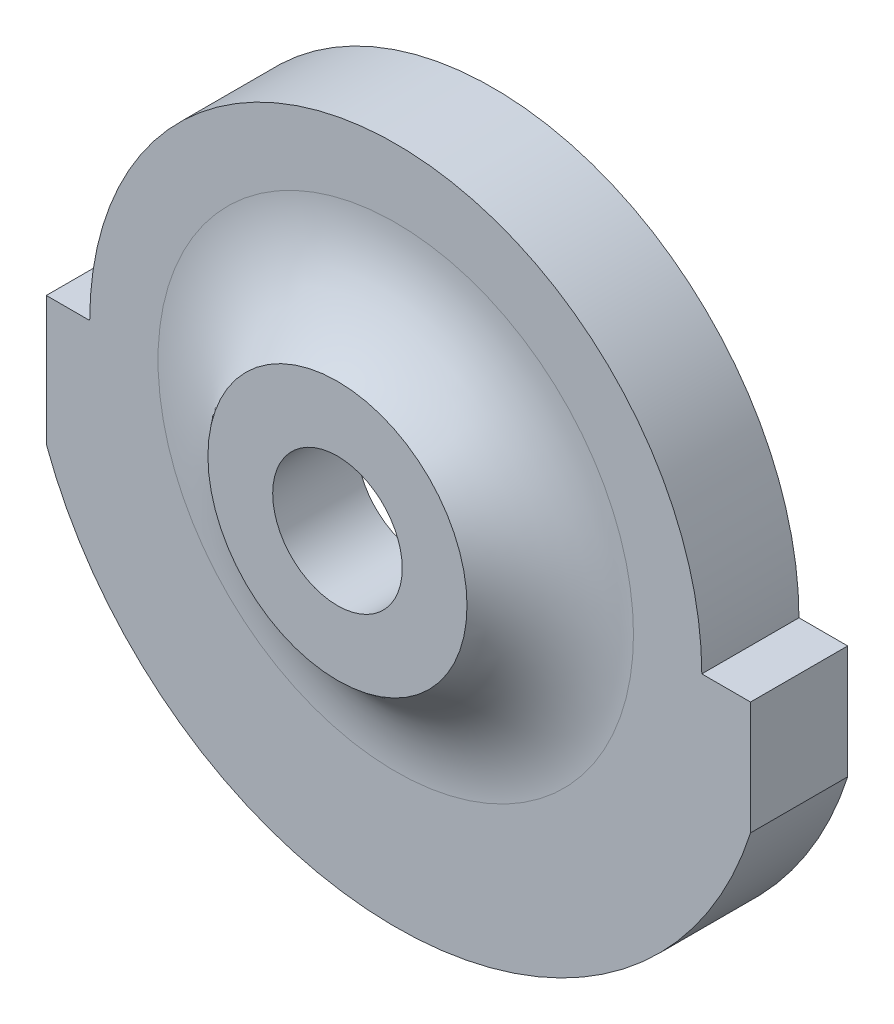
ISO-10303-21;
HEADER;
FILE_DESCRIPTION(('STEP AP214'),'2;1');
FILE_NAME('part.step','',(''),(''),'','','');
FILE_SCHEMA(('AUTOMOTIVE_DESIGN { 1 0 10303 214 1 1 1 1 }'));
ENDSEC;
DATA;
#1=APPLICATION_CONTEXT('core data for automotive mechanical design processes');
#2=APPLICATION_PROTOCOL_DEFINITION('international standard','automotive_design',2000,#1);
#3=PRODUCT_CONTEXT('',#1,'mechanical');
#4=PRODUCT('Part','Part','',(#3));
#5=PRODUCT_RELATED_PRODUCT_CATEGORY('part','',(#4));
#6=PRODUCT_DEFINITION_FORMATION('','',#4);
#7=PRODUCT_DEFINITION_CONTEXT('part definition',#1,'design');
#8=PRODUCT_DEFINITION('design','',#6,#7);
#9=PRODUCT_DEFINITION_SHAPE('','',#8);
#10=(LENGTH_UNIT() NAMED_UNIT(*) SI_UNIT(.MILLI.,.METRE.));
#11=(NAMED_UNIT(*) PLANE_ANGLE_UNIT() SI_UNIT($,.RADIAN.));
#12=(NAMED_UNIT(*) SI_UNIT($,.STERADIAN.) SOLID_ANGLE_UNIT());
#13=UNCERTAINTY_MEASURE_WITH_UNIT(LENGTH_MEASURE(1.E-05),#10,'distance_accuracy_value','');
#14=(GEOMETRIC_REPRESENTATION_CONTEXT(3) GLOBAL_UNCERTAINTY_ASSIGNED_CONTEXT((#13)) GLOBAL_UNIT_ASSIGNED_CONTEXT((#10,
#11,#12)) REPRESENTATION_CONTEXT('',''));
#15=CARTESIAN_POINT('',(0.,0.,0.));
#16=DIRECTION('',(0.,0.,1.));
#17=DIRECTION('',(1.,0.,0.));
#18=AXIS2_PLACEMENT_3D('',#15,#16,#17);
#19=CARTESIAN_POINT('',(-9.43689570931383E-13,7.91033905045424E-13,11.));
#20=DIRECTION('',(0.,0.,1.));
#21=DIRECTION('',(1.,0.,0.));
#22=AXIS2_PLACEMENT_3D('',#19,#20,#21);
#23=PLANE('',#22);
#24=DIRECTION('',(0.,1.,0.));
#25=VECTOR('',#24,1.);
#26=CARTESIAN_POINT('',(-10.7898330417497,0.,11.));
#27=LINE('',#26,#25);
#28=CARTESIAN_POINT('',(-10.7898330417497,-3.97863078598234,11.));
#29=VERTEX_POINT('',#28);
#30=CARTESIAN_POINT('',(-10.7898330417497,0.,11.));
#31=VERTEX_POINT('',#30);
#32=EDGE_CURVE('E56',#29,#31,#27,.T.);
#33=ORIENTED_EDGE('',*,*,#32,.F.);
#34=CARTESIAN_POINT('',(-9.43689570931383E-13,7.91033905045424E-13,11.));
#35=DIRECTION('',(0.,0.,1.));
#36=DIRECTION('',(1.,0.,0.));
#37=AXIS2_PLACEMENT_3D('',#34,#35,#36);
#38=CIRCLE('',#37,11.4999999999998);
#39=CARTESIAN_POINT('',(10.9544511501005,-3.50000000000316,11.));
#40=VERTEX_POINT('',#39);
#41=EDGE_CURVE('E169',#29,#40,#38,.T.);
#42=ORIENTED_EDGE('',*,*,#41,.T.);
#43=DIRECTION('',(0.,-1.,0.));
#44=VECTOR('',#43,1.);
#45=CARTESIAN_POINT('',(10.9544511501005,0.,11.));
#46=LINE('',#45,#44);
#47=CARTESIAN_POINT('',(10.9544511501005,0.,11.));
#48=VERTEX_POINT('',#47);
#49=EDGE_CURVE('E327',#48,#40,#46,.T.);
#50=ORIENTED_EDGE('',*,*,#49,.F.);
#51=DIRECTION('',(-1.,0.,0.));
#52=VECTOR('',#51,1.);
#53=CARTESIAN_POINT('',(-9.43689570931384E-13,0.,11.));
#54=LINE('',#53,#52);
#55=CARTESIAN_POINT('',(9.45,0.,11.));
#56=VERTEX_POINT('',#55);
#57=EDGE_CURVE('E218',#48,#56,#54,.T.);
#58=ORIENTED_EDGE('',*,*,#57,.T.);
#59=CARTESIAN_POINT('',(0.,0.,11.));
#60=DIRECTION('',(0.,0.,1.));
#61=DIRECTION('',(1.,0.,0.));
#62=AXIS2_PLACEMENT_3D('',#59,#60,#61);
#63=CIRCLE('',#62,9.45);
#64=CARTESIAN_POINT('',(-9.45,0.,11.));
#65=VERTEX_POINT('',#64);
#66=EDGE_CURVE('E220',#56,#65,#63,.T.);
#67=ORIENTED_EDGE('',*,*,#66,.T.);
#68=DIRECTION('',(-1.,0.,0.));
#69=VECTOR('',#68,1.);
#70=CARTESIAN_POINT('',(-9.43689570931382E-13,0.,11.));
#71=LINE('',#70,#69);
#72=EDGE_CURVE('E171',#65,#31,#71,.T.);
#73=ORIENTED_EDGE('',*,*,#72,.T.);
#74=EDGE_LOOP('',(#33,#42,#50,#58,#67,#73));
#75=FACE_BOUND('',#74,.T.);
#76=CARTESIAN_POINT('',(-9.43689570931383E-13,7.91033905045424E-13,11.));
#77=DIRECTION('',(0.,0.,1.));
#78=DIRECTION('',(1.,0.,0.));
#79=AXIS2_PLACEMENT_3D('',#76,#77,#78);
#80=CIRCLE('',#79,7.34065861769801);
#81=CARTESIAN_POINT('',(7.34065861769707,7.91033905045424E-13,11.));
#82=VERTEX_POINT('',#81);
#83=EDGE_CURVE('E177',#82,#82,#80,.F.);
#84=ORIENTED_EDGE('',*,*,#83,.T.);
#85=EDGE_LOOP('',(#84));
#86=FACE_BOUND('',#85,.T.);
#87=ADVANCED_FACE('F34',(#75,#86),#23,.T.);
#88=CARTESIAN_POINT('',(-9.43689570931383E-13,7.91033905045424E-13,8.));
#89=DIRECTION('',(0.,0.,1.));
#90=DIRECTION('',(1.,0.,0.));
#91=AXIS2_PLACEMENT_3D('',#88,#89,#90);
#92=PLANE('',#91);
#93=CARTESIAN_POINT('',(-9.43689570931383E-13,7.91033905045424E-13,8.));
#94=DIRECTION('',(0.,0.,1.));
#95=DIRECTION('',(1.,0.,0.));
#96=AXIS2_PLACEMENT_3D('',#93,#94,#95);
#97=CIRCLE('',#96,11.4999999999998);
#98=CARTESIAN_POINT('',(-10.7898330417497,-3.97863078598234,8.));
#99=VERTEX_POINT('',#98);
#100=CARTESIAN_POINT('',(4.57684389071445,-10.55,8.));
#101=VERTEX_POINT('',#100);
#102=EDGE_CURVE('E178',#99,#101,#97,.T.);
#103=ORIENTED_EDGE('',*,*,#102,.F.);
#104=DIRECTION('',(0.,1.,0.));
#105=VECTOR('',#104,1.);
#106=CARTESIAN_POINT('',(-10.7898330417497,7.91033905045424E-13,8.));
#107=LINE('',#106,#105);
#108=CARTESIAN_POINT('',(-10.7898330417497,0.,8.));
#109=VERTEX_POINT('',#108);
#110=EDGE_CURVE('E159',#99,#109,#107,.T.);
#111=ORIENTED_EDGE('',*,*,#110,.T.);
#112=DIRECTION('',(1.,0.,0.));
#113=VECTOR('',#112,1.);
#114=CARTESIAN_POINT('',(-11.4999999999994,0.,8.));
#115=LINE('',#114,#113);
#116=CARTESIAN_POINT('',(-9.45,0.,8.));
#117=VERTEX_POINT('',#116);
#118=EDGE_CURVE('E198',#109,#117,#115,.T.);
#119=ORIENTED_EDGE('',*,*,#118,.T.);
#120=CARTESIAN_POINT('',(0.,0.,8.));
#121=DIRECTION('',(0.,0.,-1.));
#122=DIRECTION('',(-1.,0.,0.));
#123=AXIS2_PLACEMENT_3D('',#120,#121,#122);
#124=CIRCLE('',#123,9.45);
#125=CARTESIAN_POINT('',(9.45,0.,8.));
#126=VERTEX_POINT('',#125);
#127=EDGE_CURVE('E206',#117,#126,#124,.T.);
#128=ORIENTED_EDGE('',*,*,#127,.T.);
#129=DIRECTION('',(1.,0.,0.));
#130=VECTOR('',#129,1.);
#131=CARTESIAN_POINT('',(11.4999999999994,0.,8.));
#132=LINE('',#131,#130);
#133=CARTESIAN_POINT('',(10.9544511501005,0.,8.));
#134=VERTEX_POINT('',#133);
#135=EDGE_CURVE('E208',#126,#134,#132,.T.);
#136=ORIENTED_EDGE('',*,*,#135,.T.);
#137=DIRECTION('',(0.,-1.,0.));
#138=VECTOR('',#137,1.);
#139=CARTESIAN_POINT('',(10.9544511501005,7.80175080144564E-13,8.));
#140=LINE('',#139,#138);
#141=CARTESIAN_POINT('',(10.9544511501005,-3.50000000000316,8.));
#142=VERTEX_POINT('',#141);
#143=EDGE_CURVE('E48',#134,#142,#140,.T.);
#144=ORIENTED_EDGE('',*,*,#143,.T.);
#145=CARTESIAN_POINT('',(7.69074118664563,-8.55,8.));
#146=VERTEX_POINT('',#145);
#147=EDGE_CURVE('E183',#146,#142,#97,.T.);
#148=ORIENTED_EDGE('',*,*,#147,.F.);
#149=DIRECTION('',(1.,0.,0.));
#150=VECTOR('',#149,1.);
#151=CARTESIAN_POINT('',(3.15,-8.55,8.));
#152=LINE('',#151,#150);
#153=CARTESIAN_POINT('',(3.15,-8.55,8.));
#154=VERTEX_POINT('',#153);
#155=EDGE_CURVE('E270',#154,#146,#152,.T.);
#156=ORIENTED_EDGE('',*,*,#155,.F.);
#157=DIRECTION('',(0.,-1.,0.));
#158=VECTOR('',#157,1.);
#159=CARTESIAN_POINT('',(3.15,-8.55,8.));
#160=LINE('',#159,#158);
#161=CARTESIAN_POINT('',(3.15,-6.55,8.));
#162=VERTEX_POINT('',#161);
#163=EDGE_CURVE('E267',#162,#154,#160,.T.);
#164=ORIENTED_EDGE('',*,*,#163,.F.);
#165=DIRECTION('',(-1.,0.,0.));
#166=VECTOR('',#165,1.);
#167=CARTESIAN_POINT('',(5.55,-6.55,8.));
#168=LINE('',#167,#166);
#169=CARTESIAN_POINT('',(5.55,-6.55,8.));
#170=VERTEX_POINT('',#169);
#171=EDGE_CURVE('E264',#170,#162,#168,.T.);
#172=ORIENTED_EDGE('',*,*,#171,.F.);
#173=DIRECTION('',(0.,-1.,0.));
#174=VECTOR('',#173,1.);
#175=CARTESIAN_POINT('',(5.55,2.65,8.));
#176=LINE('',#175,#174);
#177=CARTESIAN_POINT('',(5.55,2.65,8.));
#178=VERTEX_POINT('',#177);
#179=EDGE_CURVE('E261',#178,#170,#176,.T.);
#180=ORIENTED_EDGE('',*,*,#179,.F.);
#181=DIRECTION('',(0.707106781186547,-0.707106781186547,0.));
#182=VECTOR('',#181,1.);
#183=CARTESIAN_POINT('',(2.65,5.55,8.));
#184=LINE('',#183,#182);
#185=CARTESIAN_POINT('',(2.65,5.55,8.));
#186=VERTEX_POINT('',#185);
#187=EDGE_CURVE('E225',#186,#178,#184,.T.);
#188=ORIENTED_EDGE('',*,*,#187,.F.);
#189=DIRECTION('',(1.,0.,0.));
#190=VECTOR('',#189,1.);
#191=CARTESIAN_POINT('',(2.65,5.55,8.));
#192=LINE('',#191,#190);
#193=CARTESIAN_POINT('',(-2.65,5.55,8.));
#194=VERTEX_POINT('',#193);
#195=EDGE_CURVE('E230',#194,#186,#192,.T.);
#196=ORIENTED_EDGE('',*,*,#195,.F.);
#197=DIRECTION('',(0.707106781186548,0.707106781186547,0.));
#198=VECTOR('',#197,1.);
#199=CARTESIAN_POINT('',(-2.65,5.55,8.));
#200=LINE('',#199,#198);
#201=CARTESIAN_POINT('',(-5.55,2.65,8.));
#202=VERTEX_POINT('',#201);
#203=EDGE_CURVE('E283',#202,#194,#200,.T.);
#204=ORIENTED_EDGE('',*,*,#203,.F.);
#205=DIRECTION('',(0.,1.,0.));
#206=VECTOR('',#205,1.);
#207=CARTESIAN_POINT('',(-5.55,2.65,8.));
#208=LINE('',#207,#206);
#209=CARTESIAN_POINT('',(-5.55,-6.55,8.));
#210=VERTEX_POINT('',#209);
#211=EDGE_CURVE('E280',#210,#202,#208,.T.);
#212=ORIENTED_EDGE('',*,*,#211,.F.);
#213=DIRECTION('',(-1.,0.,0.));
#214=VECTOR('',#213,1.);
#215=CARTESIAN_POINT('',(-3.15,-6.55,8.));
#216=LINE('',#215,#214);
#217=CARTESIAN_POINT('',(-3.15,-6.55,8.));
#218=VERTEX_POINT('',#217);
#219=EDGE_CURVE('E277',#218,#210,#216,.T.);
#220=ORIENTED_EDGE('',*,*,#219,.F.);
#221=DIRECTION('',(0.,1.,0.));
#222=VECTOR('',#221,1.);
#223=CARTESIAN_POINT('',(-3.15,-10.55,8.));
#224=LINE('',#223,#222);
#225=CARTESIAN_POINT('',(-3.15,-10.55,8.));
#226=VERTEX_POINT('',#225);
#227=EDGE_CURVE('E274',#226,#218,#224,.T.);
#228=ORIENTED_EDGE('',*,*,#227,.F.);
#229=DIRECTION('',(-1.,0.,0.));
#230=VECTOR('',#229,1.);
#231=CARTESIAN_POINT('',(3.15,-10.55,8.));
#232=LINE('',#231,#230);
#233=EDGE_CURVE('E272',#101,#226,#232,.T.);
#234=ORIENTED_EDGE('',*,*,#233,.F.);
#235=EDGE_LOOP('',(#103,#111,#119,#128,#136,#144,#148,#156,#164,#172,#180,#188,#196,#204,#212,
#220,#228,#234));
#236=FACE_BOUND('',#235,.T.);
#237=ADVANCED_FACE('F196',(#236),#92,.F.);
#238=CARTESIAN_POINT('',(-9.43689570931383E-13,7.91033905045424E-13,11.));
#239=DIRECTION('',(0.,0.,-1.));
#240=DIRECTION('',(-1.,0.,0.));
#241=AXIS2_PLACEMENT_3D('',#238,#239,#240);
#242=CYLINDRICAL_SURFACE('',#241,2.00000000000836);
#243=CARTESIAN_POINT('',(-9.43689570931383E-13,7.91033905045424E-13,12.8));
#244=DIRECTION('',(0.,0.,1.));
#245=DIRECTION('',(1.,0.,0.));
#246=AXIS2_PLACEMENT_3D('',#243,#244,#245);
#247=CIRCLE('',#246,2.00000000000836);
#248=CARTESIAN_POINT('',(2.00000000000741,7.91033905045424E-13,12.8));
#249=VERTEX_POINT('',#248);
#250=EDGE_CURVE('E309',#249,#249,#247,.T.);
#251=ORIENTED_EDGE('',*,*,#250,.T.);
#252=EDGE_LOOP('',(#251));
#253=FACE_BOUND('',#252,.T.);
#254=CARTESIAN_POINT('',(0.,0.,10.2));
#255=DIRECTION('',(0.,0.,-1.));
#256=DIRECTION('',(-1.,0.,0.));
#257=AXIS2_PLACEMENT_3D('',#254,#255,#256);
#258=CIRCLE('',#257,2.00000000000721);
#259=CARTESIAN_POINT('',(-2.00000000000721,0.,10.2));
#260=VERTEX_POINT('',#259);
#261=EDGE_CURVE('E222',#260,#260,#258,.T.);
#262=ORIENTED_EDGE('',*,*,#261,.T.);
#263=EDGE_LOOP('',(#262));
#264=FACE_BOUND('',#263,.T.);
#265=ADVANCED_FACE('F347',(#253,#264),#242,.F.);
#266=CARTESIAN_POINT('',(-9.43689570931383E-13,7.91033905045424E-13,11.));
#267=DIRECTION('',(0.,0.,-1.));
#268=DIRECTION('',(-1.,0.,0.));
#269=AXIS2_PLACEMENT_3D('',#266,#267,#268);
#270=CYLINDRICAL_SURFACE('',#269,11.4999999999998);
#271=ORIENTED_EDGE('',*,*,#41,.F.);
#272=DIRECTION('',(0.,0.,1.));
#273=VECTOR('',#272,1.);
#274=CARTESIAN_POINT('',(-10.7898330417497,-3.97863078598234,0.999999999999999));
#275=LINE('',#274,#273);
#276=EDGE_CURVE('E156',#99,#29,#275,.T.);
#277=ORIENTED_EDGE('',*,*,#276,.F.);
#278=ORIENTED_EDGE('',*,*,#102,.T.);
#279=DIRECTION('',(0.,0.,-1.));
#280=VECTOR('',#279,1.);
#281=CARTESIAN_POINT('',(4.57684389071445,-10.55,11.));
#282=LINE('',#281,#280);
#283=CARTESIAN_POINT('',(4.57684389071445,-10.55,10.2));
#284=VERTEX_POINT('',#283);
#285=EDGE_CURVE('E191',#101,#284,#282,.F.);
#286=ORIENTED_EDGE('',*,*,#285,.T.);
#287=CARTESIAN_POINT('',(-9.43689570931383E-13,7.91033905045424E-13,10.2));
#288=DIRECTION('',(0.,0.,-1.));
#289=DIRECTION('',(-1.,0.,0.));
#290=AXIS2_PLACEMENT_3D('',#287,#288,#289);
#291=CIRCLE('',#290,11.4999999999998);
#292=CARTESIAN_POINT('',(7.69074118664563,-8.55,10.2));
#293=VERTEX_POINT('',#292);
#294=EDGE_CURVE('E290',#293,#284,#291,.T.);
#295=ORIENTED_EDGE('',*,*,#294,.F.);
#296=DIRECTION('',(0.,0.,-1.));
#297=VECTOR('',#296,1.);
#298=CARTESIAN_POINT('',(7.69074118664563,-8.55,11.));
#299=LINE('',#298,#297);
#300=EDGE_CURVE('E181',#293,#146,#299,.T.);
#301=ORIENTED_EDGE('',*,*,#300,.T.);
#302=ORIENTED_EDGE('',*,*,#147,.T.);
#303=DIRECTION('',(0.,0.,1.));
#304=VECTOR('',#303,1.);
#305=CARTESIAN_POINT('',(10.9544511501005,-3.50000000000316,0.999999999999999));
#306=LINE('',#305,#304);
#307=EDGE_CURVE('E172',#142,#40,#306,.T.);
#308=ORIENTED_EDGE('',*,*,#307,.T.);
#309=EDGE_LOOP('',(#271,#277,#278,#286,#295,#301,#302,#308));
#310=FACE_BOUND('',#309,.T.);
#311=ADVANCED_FACE('F175',(#310),#270,.T.);
#312=CARTESIAN_POINT('',(-9.43689570931383E-13,7.91033905045424E-13,12.8));
#313=DIRECTION('',(0.,0.,1.));
#314=DIRECTION('',(1.,0.,0.));
#315=AXIS2_PLACEMENT_3D('',#312,#313,#314);
#316=PLANE('',#315);
#317=CARTESIAN_POINT('',(-9.43689570931383E-13,7.91033905045424E-13,12.8));
#318=DIRECTION('',(0.,0.,1.));
#319=DIRECTION('',(1.,0.,0.));
#320=AXIS2_PLACEMENT_3D('',#317,#318,#319);
#321=CIRCLE('',#320,4.);
#322=CARTESIAN_POINT('',(3.99999999999906,7.91033905045424E-13,12.8));
#323=VERTEX_POINT('',#322);
#324=EDGE_CURVE('E186',#323,#323,#321,.T.);
#325=ORIENTED_EDGE('',*,*,#324,.T.);
#326=EDGE_LOOP('',(#325));
#327=FACE_BOUND('',#326,.T.);
#328=ORIENTED_EDGE('',*,*,#250,.F.);
#329=EDGE_LOOP('',(#328));
#330=FACE_BOUND('',#329,.T.);
#331=ADVANCED_FACE('F352',(#327,#330),#316,.T.);
#332=CARTESIAN_POINT('',(-9.43689570931383E-13,7.91033905045424E-13,15.));
#333=DIRECTION('',(0.,0.,1.));
#334=DIRECTION('',(1.,0.,0.));
#335=AXIS2_PLACEMENT_3D('',#332,#333,#334);
#336=TOROIDAL_SURFACE('',#335,7.34065861769801,4.);
#337=ORIENTED_EDGE('',*,*,#83,.F.);
#338=EDGE_LOOP('',(#337));
#339=FACE_BOUND('',#338,.T.);
#340=ORIENTED_EDGE('',*,*,#324,.F.);
#341=EDGE_LOOP('',(#340));
#342=FACE_BOUND('',#341,.T.);
#343=ADVANCED_FACE('F36',(#339,#342),#336,.F.);
#344=CARTESIAN_POINT('',(3.15,-10.55,10.2));
#345=DIRECTION('',(0.,-1.,0.));
#346=DIRECTION('',(1.,0.,0.));
#347=AXIS2_PLACEMENT_3D('',#344,#345,#346);
#348=PLANE('',#347);
#349=ORIENTED_EDGE('',*,*,#233,.T.);
#350=DIRECTION('',(0.,0.,-1.));
#351=VECTOR('',#350,1.);
#352=CARTESIAN_POINT('',(-3.15,-10.55,10.2));
#353=LINE('',#352,#351);
#354=CARTESIAN_POINT('',(-3.15,-10.55,10.2));
#355=VERTEX_POINT('',#354);
#356=EDGE_CURVE('E299',#355,#226,#353,.T.);
#357=ORIENTED_EDGE('',*,*,#356,.F.);
#358=DIRECTION('',(-1.,0.,0.));
#359=VECTOR('',#358,1.);
#360=CARTESIAN_POINT('',(3.15,-10.55,10.2));
#361=LINE('',#360,#359);
#362=EDGE_CURVE('E241',#284,#355,#361,.T.);
#363=ORIENTED_EDGE('',*,*,#362,.F.);
#364=ORIENTED_EDGE('',*,*,#285,.F.);
#365=EDGE_LOOP('',(#349,#357,#363,#364));
#366=FACE_BOUND('',#365,.T.);
#367=ADVANCED_FACE('F373',(#366),#348,.F.);
#368=CARTESIAN_POINT('',(3.15,-8.55,10.2));
#369=DIRECTION('',(0.,1.,0.));
#370=DIRECTION('',(0.,0.,1.));
#371=AXIS2_PLACEMENT_3D('',#368,#369,#370);
#372=PLANE('',#371);
#373=DIRECTION('',(1.,0.,0.));
#374=VECTOR('',#373,1.);
#375=CARTESIAN_POINT('',(3.15,-8.55,10.2));
#376=LINE('',#375,#374);
#377=CARTESIAN_POINT('',(3.15,-8.55,10.2));
#378=VERTEX_POINT('',#377);
#379=EDGE_CURVE('E239',#378,#293,#376,.T.);
#380=ORIENTED_EDGE('',*,*,#379,.F.);
#381=DIRECTION('',(0.,0.,-1.));
#382=VECTOR('',#381,1.);
#383=CARTESIAN_POINT('',(3.15,-8.55,10.2));
#384=LINE('',#383,#382);
#385=EDGE_CURVE('E302',#378,#154,#384,.T.);
#386=ORIENTED_EDGE('',*,*,#385,.T.);
#387=ORIENTED_EDGE('',*,*,#155,.T.);
#388=ORIENTED_EDGE('',*,*,#300,.F.);
#389=EDGE_LOOP('',(#380,#386,#387,#388));
#390=FACE_BOUND('',#389,.T.);
#391=ADVANCED_FACE('F366',(#390),#372,.F.);
#392=CARTESIAN_POINT('',(0.,0.,10.2));
#393=DIRECTION('',(0.,0.,-1.));
#394=DIRECTION('',(-1.,0.,0.));
#395=AXIS2_PLACEMENT_3D('',#392,#393,#394);
#396=PLANE('',#395);
#397=ORIENTED_EDGE('',*,*,#261,.F.);
#398=EDGE_LOOP('',(#397));
#399=FACE_BOUND('',#398,.T.);
#400=ORIENTED_EDGE('',*,*,#294,.T.);
#401=ORIENTED_EDGE('',*,*,#362,.T.);
#402=DIRECTION('',(0.,1.,0.));
#403=VECTOR('',#402,1.);
#404=CARTESIAN_POINT('',(-3.15,-10.55,10.2));
#405=LINE('',#404,#403);
#406=CARTESIAN_POINT('',(-3.15,-6.55,10.2));
#407=VERTEX_POINT('',#406);
#408=EDGE_CURVE('E243',#355,#407,#405,.T.);
#409=ORIENTED_EDGE('',*,*,#408,.T.);
#410=DIRECTION('',(-1.,0.,0.));
#411=VECTOR('',#410,1.);
#412=CARTESIAN_POINT('',(-3.15,-6.55,10.2));
#413=LINE('',#412,#411);
#414=CARTESIAN_POINT('',(-5.55,-6.55,10.2));
#415=VERTEX_POINT('',#414);
#416=EDGE_CURVE('E246',#407,#415,#413,.T.);
#417=ORIENTED_EDGE('',*,*,#416,.T.);
#418=DIRECTION('',(0.,1.,0.));
#419=VECTOR('',#418,1.);
#420=CARTESIAN_POINT('',(-5.55,2.65,10.2));
#421=LINE('',#420,#419);
#422=CARTESIAN_POINT('',(-5.55,2.65,10.2));
#423=VERTEX_POINT('',#422);
#424=EDGE_CURVE('E249',#415,#423,#421,.T.);
#425=ORIENTED_EDGE('',*,*,#424,.T.);
#426=DIRECTION('',(0.707106781186548,0.707106781186547,0.));
#427=VECTOR('',#426,1.);
#428=CARTESIAN_POINT('',(-2.65,5.55,10.2));
#429=LINE('',#428,#427);
#430=CARTESIAN_POINT('',(-2.65,5.55,10.2));
#431=VERTEX_POINT('',#430);
#432=EDGE_CURVE('E252',#423,#431,#429,.T.);
#433=ORIENTED_EDGE('',*,*,#432,.T.);
#434=DIRECTION('',(1.,0.,0.));
#435=VECTOR('',#434,1.);
#436=CARTESIAN_POINT('',(2.65,5.55,10.2));
#437=LINE('',#436,#435);
#438=CARTESIAN_POINT('',(2.65,5.55,10.2));
#439=VERTEX_POINT('',#438);
#440=EDGE_CURVE('E255',#431,#439,#437,.T.);
#441=ORIENTED_EDGE('',*,*,#440,.T.);
#442=DIRECTION('',(0.707106781186547,-0.707106781186547,0.));
#443=VECTOR('',#442,1.);
#444=CARTESIAN_POINT('',(2.65,5.55,10.2));
#445=LINE('',#444,#443);
#446=CARTESIAN_POINT('',(5.55,2.65,10.2));
#447=VERTEX_POINT('',#446);
#448=EDGE_CURVE('E226',#439,#447,#445,.T.);
#449=ORIENTED_EDGE('',*,*,#448,.T.);
#450=DIRECTION('',(0.,-1.,0.));
#451=VECTOR('',#450,1.);
#452=CARTESIAN_POINT('',(5.55,2.65,10.2));
#453=LINE('',#452,#451);
#454=CARTESIAN_POINT('',(5.55,-6.55,10.2));
#455=VERTEX_POINT('',#454);
#456=EDGE_CURVE('E229',#447,#455,#453,.T.);
#457=ORIENTED_EDGE('',*,*,#456,.T.);
#458=DIRECTION('',(-1.,0.,0.));
#459=VECTOR('',#458,1.);
#460=CARTESIAN_POINT('',(5.55,-6.55,10.2));
#461=LINE('',#460,#459);
#462=CARTESIAN_POINT('',(3.15,-6.55,10.2));
#463=VERTEX_POINT('',#462);
#464=EDGE_CURVE('E233',#455,#463,#461,.T.);
#465=ORIENTED_EDGE('',*,*,#464,.T.);
#466=DIRECTION('',(0.,-1.,0.));
#467=VECTOR('',#466,1.);
#468=CARTESIAN_POINT('',(3.15,-8.55,10.2));
#469=LINE('',#468,#467);
#470=EDGE_CURVE('E236',#463,#378,#469,.T.);
#471=ORIENTED_EDGE('',*,*,#470,.T.);
#472=ORIENTED_EDGE('',*,*,#379,.T.);
#473=EDGE_LOOP('',(#400,#401,#409,#417,#425,#433,#441,#449,#457,#465,#471,#472));
#474=FACE_BOUND('',#473,.T.);
#475=ADVANCED_FACE('F362',(#399,#474),#396,.T.);
#476=CARTESIAN_POINT('',(2.65,5.55,10.2));
#477=DIRECTION('',(0.707106781186548,0.707106781186548,0.));
#478=DIRECTION('',(-0.707106781186548,0.707106781186548,0.));
#479=AXIS2_PLACEMENT_3D('',#476,#477,#478);
#480=PLANE('',#479);
#481=ORIENTED_EDGE('',*,*,#187,.T.);
#482=DIRECTION('',(0.,0.,-1.));
#483=VECTOR('',#482,1.);
#484=CARTESIAN_POINT('',(5.55,2.65,10.2));
#485=LINE('',#484,#483);
#486=EDGE_CURVE('E258',#447,#178,#485,.T.);
#487=ORIENTED_EDGE('',*,*,#486,.F.);
#488=ORIENTED_EDGE('',*,*,#448,.F.);
#489=DIRECTION('',(0.,0.,-1.));
#490=VECTOR('',#489,1.);
#491=CARTESIAN_POINT('',(2.65,5.55,10.2));
#492=LINE('',#491,#490);
#493=EDGE_CURVE('E288',#439,#186,#492,.T.);
#494=ORIENTED_EDGE('',*,*,#493,.T.);
#495=EDGE_LOOP('',(#481,#487,#488,#494));
#496=FACE_BOUND('',#495,.T.);
#497=ADVANCED_FACE('F365',(#496),#480,.F.);
#498=CARTESIAN_POINT('',(2.65,5.55,10.2));
#499=DIRECTION('',(0.,1.,0.));
#500=DIRECTION('',(0.,0.,1.));
#501=AXIS2_PLACEMENT_3D('',#498,#499,#500);
#502=PLANE('',#501);
#503=ORIENTED_EDGE('',*,*,#195,.T.);
#504=ORIENTED_EDGE('',*,*,#493,.F.);
#505=ORIENTED_EDGE('',*,*,#440,.F.);
#506=DIRECTION('',(0.,0.,-1.));
#507=VECTOR('',#506,1.);
#508=CARTESIAN_POINT('',(-2.65,5.55,10.2));
#509=LINE('',#508,#507);
#510=EDGE_CURVE('E291',#431,#194,#509,.T.);
#511=ORIENTED_EDGE('',*,*,#510,.T.);
#512=EDGE_LOOP('',(#503,#504,#505,#511));
#513=FACE_BOUND('',#512,.T.);
#514=ADVANCED_FACE('F392',(#513),#502,.F.);
#515=CARTESIAN_POINT('',(-2.65,5.55,10.2));
#516=DIRECTION('',(-0.707106781186547,0.707106781186548,0.));
#517=DIRECTION('',(-0.707106781186548,-0.707106781186547,0.));
#518=AXIS2_PLACEMENT_3D('',#515,#516,#517);
#519=PLANE('',#518);
#520=ORIENTED_EDGE('',*,*,#203,.T.);
#521=ORIENTED_EDGE('',*,*,#510,.F.);
#522=ORIENTED_EDGE('',*,*,#432,.F.);
#523=DIRECTION('',(0.,0.,-1.));
#524=VECTOR('',#523,1.);
#525=CARTESIAN_POINT('',(-5.55,2.65,10.2));
#526=LINE('',#525,#524);
#527=EDGE_CURVE('E293',#423,#202,#526,.T.);
#528=ORIENTED_EDGE('',*,*,#527,.T.);
#529=EDGE_LOOP('',(#520,#521,#522,#528));
#530=FACE_BOUND('',#529,.T.);
#531=ADVANCED_FACE('F389',(#530),#519,.F.);
#532=CARTESIAN_POINT('',(-5.55,2.65,10.2));
#533=DIRECTION('',(-1.,0.,0.));
#534=DIRECTION('',(0.,-1.,0.));
#535=AXIS2_PLACEMENT_3D('',#532,#533,#534);
#536=PLANE('',#535);
#537=ORIENTED_EDGE('',*,*,#211,.T.);
#538=ORIENTED_EDGE('',*,*,#527,.F.);
#539=ORIENTED_EDGE('',*,*,#424,.F.);
#540=DIRECTION('',(0.,0.,-1.));
#541=VECTOR('',#540,1.);
#542=CARTESIAN_POINT('',(-5.55,-6.55,10.2));
#543=LINE('',#542,#541);
#544=EDGE_CURVE('E295',#415,#210,#543,.T.);
#545=ORIENTED_EDGE('',*,*,#544,.T.);
#546=EDGE_LOOP('',(#537,#538,#539,#545));
#547=FACE_BOUND('',#546,.T.);
#548=ADVANCED_FACE('F385',(#547),#536,.F.);
#549=CARTESIAN_POINT('',(-3.15,-6.55,10.2));
#550=DIRECTION('',(0.,-1.,0.));
#551=DIRECTION('',(0.,0.,-1.));
#552=AXIS2_PLACEMENT_3D('',#549,#550,#551);
#553=PLANE('',#552);
#554=ORIENTED_EDGE('',*,*,#219,.T.);
#555=ORIENTED_EDGE('',*,*,#544,.F.);
#556=ORIENTED_EDGE('',*,*,#416,.F.);
#557=DIRECTION('',(0.,0.,-1.));
#558=VECTOR('',#557,1.);
#559=CARTESIAN_POINT('',(-3.15,-6.55,10.2));
#560=LINE('',#559,#558);
#561=EDGE_CURVE('E297',#407,#218,#560,.T.);
#562=ORIENTED_EDGE('',*,*,#561,.T.);
#563=EDGE_LOOP('',(#554,#555,#556,#562));
#564=FACE_BOUND('',#563,.T.);
#565=ADVANCED_FACE('F381',(#564),#553,.F.);
#566=CARTESIAN_POINT('',(-3.15,-10.55,10.2));
#567=DIRECTION('',(-1.,0.,0.));
#568=DIRECTION('',(0.,-1.,0.));
#569=AXIS2_PLACEMENT_3D('',#566,#567,#568);
#570=PLANE('',#569);
#571=ORIENTED_EDGE('',*,*,#227,.T.);
#572=ORIENTED_EDGE('',*,*,#561,.F.);
#573=ORIENTED_EDGE('',*,*,#408,.F.);
#574=ORIENTED_EDGE('',*,*,#356,.T.);
#575=EDGE_LOOP('',(#571,#572,#573,#574));
#576=FACE_BOUND('',#575,.T.);
#577=ADVANCED_FACE('F377',(#576),#570,.F.);
#578=CARTESIAN_POINT('',(3.15,-8.55,10.2));
#579=DIRECTION('',(1.,0.,0.));
#580=DIRECTION('',(0.,0.,-1.));
#581=AXIS2_PLACEMENT_3D('',#578,#579,#580);
#582=PLANE('',#581);
#583=ORIENTED_EDGE('',*,*,#163,.T.);
#584=ORIENTED_EDGE('',*,*,#385,.F.);
#585=ORIENTED_EDGE('',*,*,#470,.F.);
#586=DIRECTION('',(0.,0.,-1.));
#587=VECTOR('',#586,1.);
#588=CARTESIAN_POINT('',(3.15,-6.55,10.2));
#589=LINE('',#588,#587);
#590=EDGE_CURVE('E304',#463,#162,#589,.T.);
#591=ORIENTED_EDGE('',*,*,#590,.T.);
#592=EDGE_LOOP('',(#583,#584,#585,#591));
#593=FACE_BOUND('',#592,.T.);
#594=ADVANCED_FACE('F406',(#593),#582,.F.);
#595=CARTESIAN_POINT('',(5.55,-6.55,10.2));
#596=DIRECTION('',(0.,-1.,0.));
#597=DIRECTION('',(0.,0.,-1.));
#598=AXIS2_PLACEMENT_3D('',#595,#596,#597);
#599=PLANE('',#598);
#600=ORIENTED_EDGE('',*,*,#171,.T.);
#601=ORIENTED_EDGE('',*,*,#590,.F.);
#602=ORIENTED_EDGE('',*,*,#464,.F.);
#603=DIRECTION('',(0.,0.,-1.));
#604=VECTOR('',#603,1.);
#605=CARTESIAN_POINT('',(5.55,-6.55,10.2));
#606=LINE('',#605,#604);
#607=EDGE_CURVE('E306',#455,#170,#606,.T.);
#608=ORIENTED_EDGE('',*,*,#607,.T.);
#609=EDGE_LOOP('',(#600,#601,#602,#608));
#610=FACE_BOUND('',#609,.T.);
#611=ADVANCED_FACE('F403',(#610),#599,.F.);
#612=CARTESIAN_POINT('',(5.55,2.65,10.2));
#613=DIRECTION('',(1.,0.,0.));
#614=DIRECTION('',(0.,1.,0.));
#615=AXIS2_PLACEMENT_3D('',#612,#613,#614);
#616=PLANE('',#615);
#617=ORIENTED_EDGE('',*,*,#179,.T.);
#618=ORIENTED_EDGE('',*,*,#607,.F.);
#619=ORIENTED_EDGE('',*,*,#456,.F.);
#620=ORIENTED_EDGE('',*,*,#486,.T.);
#621=EDGE_LOOP('',(#617,#618,#619,#620));
#622=FACE_BOUND('',#621,.T.);
#623=ADVANCED_FACE('F340',(#622),#616,.F.);
#624=CARTESIAN_POINT('',(11.4999999999994,0.,12.8));
#625=DIRECTION('',(0.,1.,0.));
#626=DIRECTION('',(-1.,0.,0.));
#627=AXIS2_PLACEMENT_3D('',#624,#625,#626);
#628=PLANE('',#627);
#629=DIRECTION('',(0.,0.,1.));
#630=VECTOR('',#629,1.);
#631=CARTESIAN_POINT('',(10.9544511501005,0.,12.8));
#632=LINE('',#631,#630);
#633=EDGE_CURVE('E11',#134,#48,#632,.T.);
#634=ORIENTED_EDGE('',*,*,#633,.F.);
#635=ORIENTED_EDGE('',*,*,#135,.F.);
#636=DIRECTION('',(0.,0.,-1.));
#637=VECTOR('',#636,1.);
#638=CARTESIAN_POINT('',(9.45,0.,12.8));
#639=LINE('',#638,#637);
#640=EDGE_CURVE('E214',#56,#126,#639,.T.);
#641=ORIENTED_EDGE('',*,*,#640,.F.);
#642=ORIENTED_EDGE('',*,*,#57,.F.);
#643=EDGE_LOOP('',(#634,#635,#641,#642));
#644=FACE_BOUND('',#643,.T.);
#645=ADVANCED_FACE('F324',(#644),#628,.T.);
#646=CARTESIAN_POINT('',(0.,0.,12.8));
#647=DIRECTION('',(0.,0.,-1.));
#648=DIRECTION('',(-1.,0.,0.));
#649=AXIS2_PLACEMENT_3D('',#646,#647,#648);
#650=CYLINDRICAL_SURFACE('',#649,9.45);
#651=ORIENTED_EDGE('',*,*,#640,.T.);
#652=ORIENTED_EDGE('',*,*,#127,.F.);
#653=DIRECTION('',(0.,0.,-1.));
#654=VECTOR('',#653,1.);
#655=CARTESIAN_POINT('',(-9.45,0.,12.8));
#656=LINE('',#655,#654);
#657=EDGE_CURVE('E204',#65,#117,#656,.T.);
#658=ORIENTED_EDGE('',*,*,#657,.F.);
#659=ORIENTED_EDGE('',*,*,#66,.F.);
#660=EDGE_LOOP('',(#651,#652,#658,#659));
#661=FACE_BOUND('',#660,.T.);
#662=ADVANCED_FACE('F332',(#661),#650,.T.);
#663=CARTESIAN_POINT('',(-11.4999999999994,0.,12.8));
#664=DIRECTION('',(0.,1.,0.));
#665=DIRECTION('',(-1.,0.,0.));
#666=AXIS2_PLACEMENT_3D('',#663,#664,#665);
#667=PLANE('',#666);
#668=DIRECTION('',(0.,0.,-1.));
#669=VECTOR('',#668,1.);
#670=CARTESIAN_POINT('',(-10.7898330417497,0.,12.8));
#671=LINE('',#670,#669);
#672=EDGE_CURVE('E42',#31,#109,#671,.T.);
#673=ORIENTED_EDGE('',*,*,#672,.F.);
#674=ORIENTED_EDGE('',*,*,#72,.F.);
#675=ORIENTED_EDGE('',*,*,#657,.T.);
#676=ORIENTED_EDGE('',*,*,#118,.F.);
#677=EDGE_LOOP('',(#673,#674,#675,#676));
#678=FACE_BOUND('',#677,.T.);
#679=ADVANCED_FACE('F202',(#678),#667,.T.);
#680=CARTESIAN_POINT('',(-10.7898330417497,0.,0.999999999999999));
#681=DIRECTION('',(1.,0.,0.));
#682=DIRECTION('',(0.,0.,-1.));
#683=AXIS2_PLACEMENT_3D('',#680,#681,#682);
#684=PLANE('',#683);
#685=ORIENTED_EDGE('',*,*,#276,.T.);
#686=ORIENTED_EDGE('',*,*,#32,.T.);
#687=ORIENTED_EDGE('',*,*,#672,.T.);
#688=ORIENTED_EDGE('',*,*,#110,.F.);
#689=EDGE_LOOP('',(#685,#686,#687,#688));
#690=FACE_BOUND('',#689,.T.);
#691=ADVANCED_FACE('F157',(#690),#684,.F.);
#692=CARTESIAN_POINT('',(10.9544511501005,0.,0.999999999999999));
#693=DIRECTION('',(-1.,0.,0.));
#694=DIRECTION('',(0.,-1.,0.));
#695=AXIS2_PLACEMENT_3D('',#692,#693,#694);
#696=PLANE('',#695);
#697=ORIENTED_EDGE('',*,*,#633,.T.);
#698=ORIENTED_EDGE('',*,*,#49,.T.);
#699=ORIENTED_EDGE('',*,*,#307,.F.);
#700=ORIENTED_EDGE('',*,*,#143,.F.);
#701=EDGE_LOOP('',(#697,#698,#699,#700));
#702=FACE_BOUND('',#701,.T.);
#703=ADVANCED_FACE('F326',(#702),#696,.F.);
#704=CLOSED_SHELL('',(#87,#237,#265,#311,#331,#343,#367,#391,#475,#497,#514,#531,#548,#565,#577,
#594,#611,#623,#645,#662,#679,#691,#703));
#705=MANIFOLD_SOLID_BREP('B2',#704);
#706=ADVANCED_BREP_SHAPE_REPRESENTATION('',(#18,#705),#14);
#707=SHAPE_DEFINITION_REPRESENTATION(#9,#706);
ENDSEC;
END-ISO-10303-21;
